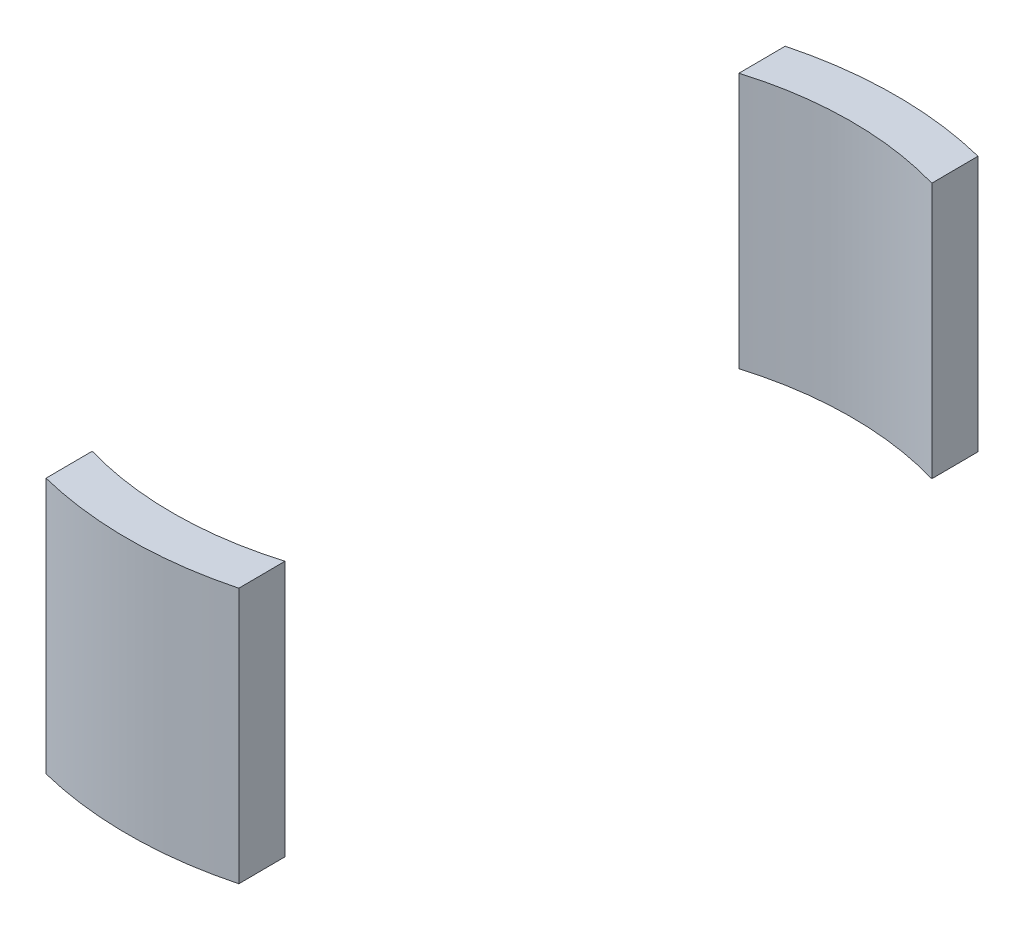
ISO-10303-21;
HEADER;
FILE_DESCRIPTION(('STEP AP214'),'2;1');
FILE_NAME('part.step','',(''),(''),'','','');
FILE_SCHEMA(('AUTOMOTIVE_DESIGN { 1 0 10303 214 1 1 1 1 }'));
ENDSEC;
DATA;
#1=APPLICATION_CONTEXT('core data for automotive mechanical design processes');
#2=APPLICATION_PROTOCOL_DEFINITION('international standard','automotive_design',2000,#1);
#3=PRODUCT_CONTEXT('',#1,'mechanical');
#4=PRODUCT('Part','Part','',(#3));
#5=PRODUCT_RELATED_PRODUCT_CATEGORY('part','',(#4));
#6=PRODUCT_DEFINITION_FORMATION('','',#4);
#7=PRODUCT_DEFINITION_CONTEXT('part definition',#1,'design');
#8=PRODUCT_DEFINITION('design','',#6,#7);
#9=PRODUCT_DEFINITION_SHAPE('','',#8);
#10=(LENGTH_UNIT() NAMED_UNIT(*) SI_UNIT(.MILLI.,.METRE.));
#11=(NAMED_UNIT(*) PLANE_ANGLE_UNIT() SI_UNIT($,.RADIAN.));
#12=(NAMED_UNIT(*) SI_UNIT($,.STERADIAN.) SOLID_ANGLE_UNIT());
#13=UNCERTAINTY_MEASURE_WITH_UNIT(LENGTH_MEASURE(1.E-05),#10,'distance_accuracy_value','');
#14=(GEOMETRIC_REPRESENTATION_CONTEXT(3) GLOBAL_UNCERTAINTY_ASSIGNED_CONTEXT((#13)) GLOBAL_UNIT_ASSIGNED_CONTEXT((#10,
#11,#12)) REPRESENTATION_CONTEXT('',''));
#15=CARTESIAN_POINT('',(0.,0.,0.));
#16=DIRECTION('',(0.,0.,1.));
#17=DIRECTION('',(1.,0.,0.));
#18=AXIS2_PLACEMENT_3D('',#15,#16,#17);
#19=CARTESIAN_POINT('',(0.,2.,0.));
#20=DIRECTION('',(0.,-1.,0.));
#21=DIRECTION('',(0.,0.,-1.));
#22=AXIS2_PLACEMENT_3D('',#19,#20,#21);
#23=CYLINDRICAL_SURFACE('',#22,3.);
#24=CARTESIAN_POINT('',(0.,0.,0.));
#25=DIRECTION('',(0.,1.,0.));
#26=DIRECTION('',(0.,0.,1.));
#27=AXIS2_PLACEMENT_3D('',#24,#25,#26);
#28=CIRCLE('',#27,3.);
#29=CARTESIAN_POINT('',(-0.730973486693002,0.,2.90958377809471));
#30=VERTEX_POINT('',#29);
#31=CARTESIAN_POINT('',(0.7664600758385,0.,2.90043771733607));
#32=VERTEX_POINT('',#31);
#33=EDGE_CURVE('E106',#30,#32,#28,.T.);
#34=ORIENTED_EDGE('',*,*,#33,.T.);
#35=DIRECTION('',(0.,-1.,0.));
#36=VECTOR('',#35,1.);
#37=CARTESIAN_POINT('',(0.7664600758385,2.,2.90043771733607));
#38=LINE('',#37,#36);
#39=CARTESIAN_POINT('',(0.7664600758385,2.,2.90043771733607));
#40=VERTEX_POINT('',#39);
#41=EDGE_CURVE('E12',#40,#32,#38,.T.);
#42=ORIENTED_EDGE('',*,*,#41,.F.);
#43=CARTESIAN_POINT('',(0.,2.,0.));
#44=DIRECTION('',(0.,1.,0.));
#45=DIRECTION('',(0.,0.,1.));
#46=AXIS2_PLACEMENT_3D('',#43,#44,#45);
#47=CIRCLE('',#46,3.);
#48=CARTESIAN_POINT('',(-0.730973486693002,2.,2.90958377809471));
#49=VERTEX_POINT('',#48);
#50=EDGE_CURVE('E94',#49,#40,#47,.T.);
#51=ORIENTED_EDGE('',*,*,#50,.F.);
#52=DIRECTION('',(0.,-1.,0.));
#53=VECTOR('',#52,1.);
#54=CARTESIAN_POINT('',(-0.730973486693002,2.,2.90958377809471));
#55=LINE('',#54,#53);
#56=EDGE_CURVE('E102',#49,#30,#55,.T.);
#57=ORIENTED_EDGE('',*,*,#56,.T.);
#58=EDGE_LOOP('',(#34,#42,#51,#57));
#59=FACE_BOUND('',#58,.T.);
#60=ADVANCED_FACE('F43',(#59),#23,.T.);
#61=CARTESIAN_POINT('',(0.764242746568798,2.,2.53740675184665));
#62=DIRECTION('',(-0.999981347764428,0.,0.00610771014688768));
#63=DIRECTION('',(0.00610771014688768,0.,0.999981347764428));
#64=AXIS2_PLACEMENT_3D('',#61,#62,#63);
#65=PLANE('',#64);
#66=DIRECTION('',(-0.00610771014688768,0.,-0.999981347764428));
#67=VECTOR('',#66,1.);
#68=CARTESIAN_POINT('',(0.764242746568798,0.,2.53740675184665));
#69=LINE('',#68,#67);
#70=CARTESIAN_POINT('',(0.764242746568797,0.,2.53740675184665));
#71=VERTEX_POINT('',#70);
#72=EDGE_CURVE('E98',#32,#71,#69,.T.);
#73=ORIENTED_EDGE('',*,*,#72,.T.);
#74=DIRECTION('',(0.,-1.,0.));
#75=VECTOR('',#74,1.);
#76=CARTESIAN_POINT('',(0.764242746568797,2.,2.53740675184665));
#77=LINE('',#76,#75);
#78=CARTESIAN_POINT('',(0.764242746568797,2.,2.53740675184665));
#79=VERTEX_POINT('',#78);
#80=EDGE_CURVE('E51',#79,#71,#77,.T.);
#81=ORIENTED_EDGE('',*,*,#80,.F.);
#82=DIRECTION('',(-0.00610771014688768,0.,-0.999981347764428));
#83=VECTOR('',#82,1.);
#84=CARTESIAN_POINT('',(0.764242746568798,2.,2.53740675184665));
#85=LINE('',#84,#83);
#86=EDGE_CURVE('E89',#40,#79,#85,.T.);
#87=ORIENTED_EDGE('',*,*,#86,.F.);
#88=ORIENTED_EDGE('',*,*,#41,.T.);
#89=EDGE_LOOP('',(#73,#81,#87,#88));
#90=FACE_BOUND('',#89,.T.);
#91=ADVANCED_FACE('F97',(#90),#65,.F.);
#92=CARTESIAN_POINT('',(0.,2.,0.));
#93=DIRECTION('',(0.,-1.,0.));
#94=DIRECTION('',(0.,0.,-1.));
#95=AXIS2_PLACEMENT_3D('',#92,#93,#94);
#96=CYLINDRICAL_SURFACE('',#95,2.65);
#97=CARTESIAN_POINT('',(0.,0.,0.));
#98=DIRECTION('',(0.,-1.,0.));
#99=DIRECTION('',(0.,0.,1.));
#100=AXIS2_PLACEMENT_3D('',#97,#98,#99);
#101=CIRCLE('',#100,2.65);
#102=CARTESIAN_POINT('',(-0.733190815962704,0.,2.5465528126053));
#103=VERTEX_POINT('',#102);
#104=EDGE_CURVE('E76',#71,#103,#101,.T.);
#105=ORIENTED_EDGE('',*,*,#104,.T.);
#106=DIRECTION('',(0.,-1.,0.));
#107=VECTOR('',#106,1.);
#108=CARTESIAN_POINT('',(-0.733190815962704,2.,2.5465528126053));
#109=LINE('',#108,#107);
#110=CARTESIAN_POINT('',(-0.733190815962704,2.,2.5465528126053));
#111=VERTEX_POINT('',#110);
#112=EDGE_CURVE('E99',#111,#103,#109,.T.);
#113=ORIENTED_EDGE('',*,*,#112,.F.);
#114=CARTESIAN_POINT('',(0.,2.,0.));
#115=DIRECTION('',(0.,-1.,0.));
#116=DIRECTION('',(0.,0.,1.));
#117=AXIS2_PLACEMENT_3D('',#114,#115,#116);
#118=CIRCLE('',#117,2.65);
#119=EDGE_CURVE('E92',#79,#111,#118,.T.);
#120=ORIENTED_EDGE('',*,*,#119,.F.);
#121=ORIENTED_EDGE('',*,*,#80,.T.);
#122=EDGE_LOOP('',(#105,#113,#120,#121));
#123=FACE_BOUND('',#122,.T.);
#124=ADVANCED_FACE('F100',(#123),#96,.F.);
#125=CARTESIAN_POINT('',(-0.733190815962704,2.,2.5465528126053));
#126=DIRECTION('',(0.999981347764428,0.,-0.00610771014688768));
#127=DIRECTION('',(-0.00610771014688768,0.,-0.999981347764428));
#128=AXIS2_PLACEMENT_3D('',#125,#126,#127);
#129=PLANE('',#128);
#130=DIRECTION('',(0.00610771014688768,0.,0.999981347764428));
#131=VECTOR('',#130,1.);
#132=CARTESIAN_POINT('',(-0.733190815962704,0.,2.5465528126053));
#133=LINE('',#132,#131);
#134=EDGE_CURVE('E82',#103,#30,#133,.T.);
#135=ORIENTED_EDGE('',*,*,#134,.T.);
#136=ORIENTED_EDGE('',*,*,#56,.F.);
#137=DIRECTION('',(0.00610771014688768,0.,0.999981347764428));
#138=VECTOR('',#137,1.);
#139=CARTESIAN_POINT('',(-0.733190815962704,2.,2.5465528126053));
#140=LINE('',#139,#138);
#141=EDGE_CURVE('E59',#111,#49,#140,.T.);
#142=ORIENTED_EDGE('',*,*,#141,.F.);
#143=ORIENTED_EDGE('',*,*,#112,.T.);
#144=EDGE_LOOP('',(#135,#136,#142,#143));
#145=FACE_BOUND('',#144,.T.);
#146=ADVANCED_FACE('F113',(#145),#129,.F.);
#147=CARTESIAN_POINT('',(0.,2.,0.));
#148=DIRECTION('',(0.,1.,0.));
#149=DIRECTION('',(0.,0.,1.));
#150=AXIS2_PLACEMENT_3D('',#147,#148,#149);
#151=PLANE('',#150);
#152=ORIENTED_EDGE('',*,*,#50,.T.);
#153=ORIENTED_EDGE('',*,*,#86,.T.);
#154=ORIENTED_EDGE('',*,*,#119,.T.);
#155=ORIENTED_EDGE('',*,*,#141,.T.);
#156=EDGE_LOOP('',(#152,#153,#154,#155));
#157=FACE_BOUND('',#156,.T.);
#158=ADVANCED_FACE('F90',(#157),#151,.T.);
#159=CARTESIAN_POINT('',(0.,0.,0.));
#160=DIRECTION('',(0.,1.,0.));
#161=DIRECTION('',(0.,0.,1.));
#162=AXIS2_PLACEMENT_3D('',#159,#160,#161);
#163=PLANE('',#162);
#164=ORIENTED_EDGE('',*,*,#33,.F.);
#165=ORIENTED_EDGE('',*,*,#134,.F.);
#166=ORIENTED_EDGE('',*,*,#104,.F.);
#167=ORIENTED_EDGE('',*,*,#72,.F.);
#168=EDGE_LOOP('',(#164,#165,#166,#167));
#169=FACE_BOUND('',#168,.T.);
#170=ADVANCED_FACE('F116',(#169),#163,.F.);
#171=CLOSED_SHELL('',(#60,#91,#124,#146,#158,#170));
#172=MANIFOLD_SOLID_BREP('B2',#171);
#173=CARTESIAN_POINT('',(0.,2.,0.));
#174=DIRECTION('',(0.,-1.,0.));
#175=DIRECTION('',(0.,0.,-1.));
#176=AXIS2_PLACEMENT_3D('',#173,#174,#175);
#177=CYLINDRICAL_SURFACE('',#176,2.65);
#178=CARTESIAN_POINT('',(0.,0.,0.));
#179=DIRECTION('',(0.,-1.,0.));
#180=DIRECTION('',(0.,0.,1.));
#181=AXIS2_PLACEMENT_3D('',#178,#179,#180);
#182=CIRCLE('',#181,2.65);
#183=CARTESIAN_POINT('',(-0.764242746568798,0.,-2.53740675184665));
#184=VERTEX_POINT('',#183);
#185=CARTESIAN_POINT('',(0.733190815962703,0.,-2.5465528126053));
#186=VERTEX_POINT('',#185);
#187=EDGE_CURVE('E230',#184,#186,#182,.T.);
#188=ORIENTED_EDGE('',*,*,#187,.T.);
#189=DIRECTION('',(0.,-1.,0.));
#190=VECTOR('',#189,1.);
#191=CARTESIAN_POINT('',(0.733190815962703,2.,-2.5465528126053));
#192=LINE('',#191,#190);
#193=CARTESIAN_POINT('',(0.733190815962703,2.,-2.5465528126053));
#194=VERTEX_POINT('',#193);
#195=EDGE_CURVE('E41',#194,#186,#192,.T.);
#196=ORIENTED_EDGE('',*,*,#195,.F.);
#197=CARTESIAN_POINT('',(0.,2.,0.));
#198=DIRECTION('',(0.,-1.,0.));
#199=DIRECTION('',(0.,0.,1.));
#200=AXIS2_PLACEMENT_3D('',#197,#198,#199);
#201=CIRCLE('',#200,2.65);
#202=CARTESIAN_POINT('',(-0.764242746568798,2.,-2.53740675184665));
#203=VERTEX_POINT('',#202);
#204=EDGE_CURVE('E218',#203,#194,#201,.T.);
#205=ORIENTED_EDGE('',*,*,#204,.F.);
#206=DIRECTION('',(0.,-1.,0.));
#207=VECTOR('',#206,1.);
#208=CARTESIAN_POINT('',(-0.764242746568798,2.,-2.53740675184665));
#209=LINE('',#208,#207);
#210=EDGE_CURVE('E226',#203,#184,#209,.T.);
#211=ORIENTED_EDGE('',*,*,#210,.T.);
#212=EDGE_LOOP('',(#188,#196,#205,#211));
#213=FACE_BOUND('',#212,.T.);
#214=ADVANCED_FACE('F167',(#213),#177,.F.);
#215=CARTESIAN_POINT('',(0.730973486693001,2.,-2.90958377809471));
#216=DIRECTION('',(-0.999981347764428,0.,0.00610771014688827));
#217=DIRECTION('',(0.00610771014688827,0.,0.999981347764428));
#218=AXIS2_PLACEMENT_3D('',#215,#216,#217);
#219=PLANE('',#218);
#220=DIRECTION('',(-0.00610771014688827,0.,-0.999981347764428));
#221=VECTOR('',#220,1.);
#222=CARTESIAN_POINT('',(0.730973486693001,0.,-2.90958377809471));
#223=LINE('',#222,#221);
#224=CARTESIAN_POINT('',(0.730973486693001,0.,-2.90958377809471));
#225=VERTEX_POINT('',#224);
#226=EDGE_CURVE('E222',#186,#225,#223,.T.);
#227=ORIENTED_EDGE('',*,*,#226,.T.);
#228=DIRECTION('',(0.,-1.,0.));
#229=VECTOR('',#228,1.);
#230=CARTESIAN_POINT('',(0.730973486693001,2.,-2.90958377809471));
#231=LINE('',#230,#229);
#232=CARTESIAN_POINT('',(0.730973486693001,2.,-2.90958377809471));
#233=VERTEX_POINT('',#232);
#234=EDGE_CURVE('E175',#233,#225,#231,.T.);
#235=ORIENTED_EDGE('',*,*,#234,.F.);
#236=DIRECTION('',(-0.00610771014688827,0.,-0.999981347764428));
#237=VECTOR('',#236,1.);
#238=CARTESIAN_POINT('',(0.730973486693001,2.,-2.90958377809471));
#239=LINE('',#238,#237);
#240=EDGE_CURVE('E213',#194,#233,#239,.T.);
#241=ORIENTED_EDGE('',*,*,#240,.F.);
#242=ORIENTED_EDGE('',*,*,#195,.T.);
#243=EDGE_LOOP('',(#227,#235,#241,#242));
#244=FACE_BOUND('',#243,.T.);
#245=ADVANCED_FACE('F221',(#244),#219,.F.);
#246=CARTESIAN_POINT('',(0.,2.,0.));
#247=DIRECTION('',(0.,-1.,0.));
#248=DIRECTION('',(0.,0.,-1.));
#249=AXIS2_PLACEMENT_3D('',#246,#247,#248);
#250=CYLINDRICAL_SURFACE('',#249,3.);
#251=CARTESIAN_POINT('',(0.,0.,0.));
#252=DIRECTION('',(0.,1.,0.));
#253=DIRECTION('',(0.,0.,1.));
#254=AXIS2_PLACEMENT_3D('',#251,#252,#253);
#255=CIRCLE('',#254,3.);
#256=CARTESIAN_POINT('',(-0.7664600758385,0.,-2.90043771733607));
#257=VERTEX_POINT('',#256);
#258=EDGE_CURVE('E200',#225,#257,#255,.T.);
#259=ORIENTED_EDGE('',*,*,#258,.T.);
#260=DIRECTION('',(0.,-1.,0.));
#261=VECTOR('',#260,1.);
#262=CARTESIAN_POINT('',(-0.7664600758385,2.,-2.90043771733607));
#263=LINE('',#262,#261);
#264=CARTESIAN_POINT('',(-0.7664600758385,2.,-2.90043771733607));
#265=VERTEX_POINT('',#264);
#266=EDGE_CURVE('E223',#265,#257,#263,.T.);
#267=ORIENTED_EDGE('',*,*,#266,.F.);
#268=CARTESIAN_POINT('',(0.,2.,0.));
#269=DIRECTION('',(0.,1.,0.));
#270=DIRECTION('',(0.,0.,1.));
#271=AXIS2_PLACEMENT_3D('',#268,#269,#270);
#272=CIRCLE('',#271,3.);
#273=EDGE_CURVE('E216',#233,#265,#272,.T.);
#274=ORIENTED_EDGE('',*,*,#273,.F.);
#275=ORIENTED_EDGE('',*,*,#234,.T.);
#276=EDGE_LOOP('',(#259,#267,#274,#275));
#277=FACE_BOUND('',#276,.T.);
#278=ADVANCED_FACE('F224',(#277),#250,.T.);
#279=CARTESIAN_POINT('',(-0.7664600758385,2.,-2.90043771733607));
#280=DIRECTION('',(0.999981347764428,0.,-0.00610771014688768));
#281=DIRECTION('',(-0.00610771014688768,0.,-0.999981347764428));
#282=AXIS2_PLACEMENT_3D('',#279,#280,#281);
#283=PLANE('',#282);
#284=DIRECTION('',(0.00610771014688768,0.,0.999981347764428));
#285=VECTOR('',#284,1.);
#286=CARTESIAN_POINT('',(-0.7664600758385,0.,-2.90043771733607));
#287=LINE('',#286,#285);
#288=EDGE_CURVE('E206',#257,#184,#287,.T.);
#289=ORIENTED_EDGE('',*,*,#288,.T.);
#290=ORIENTED_EDGE('',*,*,#210,.F.);
#291=DIRECTION('',(0.00610771014688768,0.,0.999981347764428));
#292=VECTOR('',#291,1.);
#293=CARTESIAN_POINT('',(-0.7664600758385,2.,-2.90043771733607));
#294=LINE('',#293,#292);
#295=EDGE_CURVE('E183',#265,#203,#294,.T.);
#296=ORIENTED_EDGE('',*,*,#295,.F.);
#297=ORIENTED_EDGE('',*,*,#266,.T.);
#298=EDGE_LOOP('',(#289,#290,#296,#297));
#299=FACE_BOUND('',#298,.T.);
#300=ADVANCED_FACE('F237',(#299),#283,.F.);
#301=CARTESIAN_POINT('',(0.,2.,0.));
#302=DIRECTION('',(0.,1.,0.));
#303=DIRECTION('',(0.,0.,1.));
#304=AXIS2_PLACEMENT_3D('',#301,#302,#303);
#305=PLANE('',#304);
#306=ORIENTED_EDGE('',*,*,#204,.T.);
#307=ORIENTED_EDGE('',*,*,#240,.T.);
#308=ORIENTED_EDGE('',*,*,#273,.T.);
#309=ORIENTED_EDGE('',*,*,#295,.T.);
#310=EDGE_LOOP('',(#306,#307,#308,#309));
#311=FACE_BOUND('',#310,.T.);
#312=ADVANCED_FACE('F214',(#311),#305,.T.);
#313=CARTESIAN_POINT('',(0.,0.,0.));
#314=DIRECTION('',(0.,1.,0.));
#315=DIRECTION('',(0.,0.,1.));
#316=AXIS2_PLACEMENT_3D('',#313,#314,#315);
#317=PLANE('',#316);
#318=ORIENTED_EDGE('',*,*,#187,.F.);
#319=ORIENTED_EDGE('',*,*,#288,.F.);
#320=ORIENTED_EDGE('',*,*,#258,.F.);
#321=ORIENTED_EDGE('',*,*,#226,.F.);
#322=EDGE_LOOP('',(#318,#319,#320,#321));
#323=FACE_BOUND('',#322,.T.);
#324=ADVANCED_FACE('F240',(#323),#317,.F.);
#325=CLOSED_SHELL('',(#214,#245,#278,#300,#312,#324));
#326=MANIFOLD_SOLID_BREP('B6',#325);
#327=ADVANCED_BREP_SHAPE_REPRESENTATION('',(#18,#172,#326),#14);
#328=SHAPE_DEFINITION_REPRESENTATION(#9,#327);
ENDSEC;
END-ISO-10303-21;
